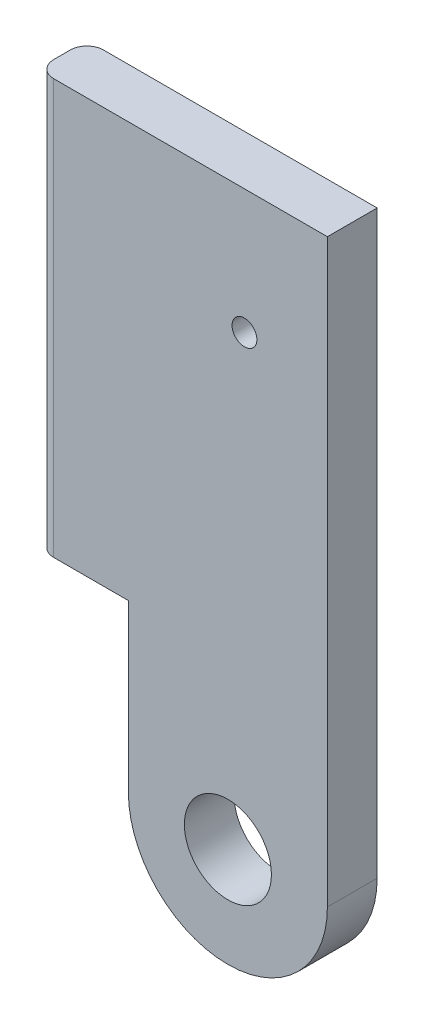
ISO-10303-21;
HEADER;
FILE_DESCRIPTION(('STEP AP214'),'2;1');
FILE_NAME('part.step','',(''),(''),'','','');
FILE_SCHEMA(('AUTOMOTIVE_DESIGN { 1 0 10303 214 1 1 1 1 }'));
ENDSEC;
DATA;
#1=APPLICATION_CONTEXT('core data for automotive mechanical design processes');
#2=APPLICATION_PROTOCOL_DEFINITION('international standard','automotive_design',2000,#1);
#3=PRODUCT_CONTEXT('',#1,'mechanical');
#4=PRODUCT('Part','Part','',(#3));
#5=PRODUCT_RELATED_PRODUCT_CATEGORY('part','',(#4));
#6=PRODUCT_DEFINITION_FORMATION('','',#4);
#7=PRODUCT_DEFINITION_CONTEXT('part definition',#1,'design');
#8=PRODUCT_DEFINITION('design','',#6,#7);
#9=PRODUCT_DEFINITION_SHAPE('','',#8);
#10=(LENGTH_UNIT() NAMED_UNIT(*) SI_UNIT(.MILLI.,.METRE.));
#11=(NAMED_UNIT(*) PLANE_ANGLE_UNIT() SI_UNIT($,.RADIAN.));
#12=(NAMED_UNIT(*) SI_UNIT($,.STERADIAN.) SOLID_ANGLE_UNIT());
#13=UNCERTAINTY_MEASURE_WITH_UNIT(LENGTH_MEASURE(1.E-05),#10,'distance_accuracy_value','');
#14=(GEOMETRIC_REPRESENTATION_CONTEXT(3) GLOBAL_UNCERTAINTY_ASSIGNED_CONTEXT((#13)) GLOBAL_UNIT_ASSIGNED_CONTEXT((#10,
#11,#12)) REPRESENTATION_CONTEXT('',''));
#15=CARTESIAN_POINT('',(0.,0.,0.));
#16=DIRECTION('',(0.,0.,1.));
#17=DIRECTION('',(1.,0.,0.));
#18=AXIS2_PLACEMENT_3D('',#15,#16,#17);
#19=CARTESIAN_POINT('',(0.,0.,3.));
#20=DIRECTION('',(0.,0.,-1.));
#21=DIRECTION('',(-1.,0.,0.));
#22=AXIS2_PLACEMENT_3D('',#19,#20,#21);
#23=CYLINDRICAL_SURFACE('',#22,6.);
#24=CARTESIAN_POINT('',(0.,0.,0.));
#25=DIRECTION('',(0.,0.,1.));
#26=DIRECTION('',(1.,0.,0.));
#27=AXIS2_PLACEMENT_3D('',#24,#25,#26);
#28=CIRCLE('',#27,6.);
#29=CARTESIAN_POINT('',(-6.,0.,0.));
#30=VERTEX_POINT('',#29);
#31=CARTESIAN_POINT('',(6.,0.,0.));
#32=VERTEX_POINT('',#31);
#33=EDGE_CURVE('E148',#30,#32,#28,.T.);
#34=ORIENTED_EDGE('',*,*,#33,.T.);
#35=DIRECTION('',(0.,0.,-1.));
#36=VECTOR('',#35,1.);
#37=CARTESIAN_POINT('',(6.,0.,3.));
#38=LINE('',#37,#36);
#39=CARTESIAN_POINT('',(6.,0.,3.));
#40=VERTEX_POINT('',#39);
#41=EDGE_CURVE('E131',#40,#32,#38,.T.);
#42=ORIENTED_EDGE('',*,*,#41,.F.);
#43=CARTESIAN_POINT('',(0.,0.,3.));
#44=DIRECTION('',(0.,0.,1.));
#45=DIRECTION('',(1.,0.,0.));
#46=AXIS2_PLACEMENT_3D('',#43,#44,#45);
#47=CIRCLE('',#46,6.);
#48=CARTESIAN_POINT('',(-6.,0.,3.));
#49=VERTEX_POINT('',#48);
#50=EDGE_CURVE('E137',#49,#40,#47,.T.);
#51=ORIENTED_EDGE('',*,*,#50,.F.);
#52=DIRECTION('',(0.,0.,-1.));
#53=VECTOR('',#52,1.);
#54=CARTESIAN_POINT('',(-6.,0.,3.));
#55=LINE('',#54,#53);
#56=EDGE_CURVE('E324',#49,#30,#55,.T.);
#57=ORIENTED_EDGE('',*,*,#56,.T.);
#58=EDGE_LOOP('',(#34,#42,#51,#57));
#59=FACE_BOUND('',#58,.T.);
#60=ADVANCED_FACE('F52',(#59),#23,.T.);
#61=CARTESIAN_POINT('',(6.,0.,3.));
#62=DIRECTION('',(-1.,0.,0.));
#63=DIRECTION('',(0.,0.,1.));
#64=AXIS2_PLACEMENT_3D('',#61,#62,#63);
#65=PLANE('',#64);
#66=DIRECTION('',(0.,1.,0.));
#67=VECTOR('',#66,1.);
#68=CARTESIAN_POINT('',(6.,0.,0.));
#69=LINE('',#68,#67);
#70=CARTESIAN_POINT('',(6.,35.,0.));
#71=VERTEX_POINT('',#70);
#72=EDGE_CURVE('E328',#32,#71,#69,.T.);
#73=ORIENTED_EDGE('',*,*,#72,.T.);
#74=DIRECTION('',(0.,0.,-1.));
#75=VECTOR('',#74,1.);
#76=CARTESIAN_POINT('',(6.,35.,3.));
#77=LINE('',#76,#75);
#78=CARTESIAN_POINT('',(6.,35.,3.));
#79=VERTEX_POINT('',#78);
#80=EDGE_CURVE('E134',#79,#71,#77,.T.);
#81=ORIENTED_EDGE('',*,*,#80,.F.);
#82=DIRECTION('',(0.,1.,0.));
#83=VECTOR('',#82,1.);
#84=CARTESIAN_POINT('',(6.,0.,3.));
#85=LINE('',#84,#83);
#86=EDGE_CURVE('E127',#40,#79,#85,.T.);
#87=ORIENTED_EDGE('',*,*,#86,.F.);
#88=ORIENTED_EDGE('',*,*,#41,.T.);
#89=EDGE_LOOP('',(#73,#81,#87,#88));
#90=FACE_BOUND('',#89,.T.);
#91=ADVANCED_FACE('F129',(#90),#65,.F.);
#92=CARTESIAN_POINT('',(0.,35.,3.));
#93=DIRECTION('',(0.,-1.,0.));
#94=DIRECTION('',(0.,0.,-1.));
#95=AXIS2_PLACEMENT_3D('',#92,#93,#94);
#96=PLANE('',#95);
#97=DIRECTION('',(-1.,0.,0.));
#98=VECTOR('',#97,1.);
#99=CARTESIAN_POINT('',(0.,35.,0.));
#100=LINE('',#99,#98);
#101=CARTESIAN_POINT('',(-10.5,35.,0.));
#102=VERTEX_POINT('',#101);
#103=EDGE_CURVE('E330',#71,#102,#100,.T.);
#104=ORIENTED_EDGE('',*,*,#103,.T.);
#105=CARTESIAN_POINT('',(-10.5,35.,0.));
#106=CARTESIAN_POINT('',(-10.528134745567,35.,2.0038154817115E-07));
#107=CARTESIAN_POINT('',(-10.5562560017052,35.,0.00118809679022485));
#108=CARTESIAN_POINT('',(-10.6122973163283,35.,0.00592711504418035));
#109=CARTESIAN_POINT('',(-10.6402173841614,35.,0.00947812636110437));
#110=CARTESIAN_POINT('',(-10.7233269372849,35.,0.0236421542785591));
#111=CARTESIAN_POINT('',(-10.7779597520746,35.,0.0377662582328391));
#112=CARTESIAN_POINT('',(-10.8840769200263,35.,0.0749850962645601));
#113=CARTESIAN_POINT('',(-10.9355597476392,35.,0.0980841377475002));
#114=CARTESIAN_POINT('',(-11.0339160760032,35.,0.152596958115516));
#115=CARTESIAN_POINT('',(-11.0807903867524,35.,0.184009272254657));
#116=CARTESIAN_POINT('',(-11.1685994578614,35.,0.254252908299715));
#117=CARTESIAN_POINT('',(-11.2095336469101,35.,0.29308494299118));
#118=CARTESIAN_POINT('',(-11.2843139872613,35.,0.377095803868768));
#119=CARTESIAN_POINT('',(-11.3181602528144,35.,0.422274527732598));
#120=CARTESIAN_POINT('',(-11.3628702542627,35.,0.493789005279562));
#121=CARTESIAN_POINT('',(-11.3767725615212,35.,0.518273097453774));
#122=CARTESIAN_POINT('',(-11.4024553813564,35.,0.568300426426298));
#123=CARTESIAN_POINT('',(-11.4142377704311,35.,0.593842701658703));
#124=CARTESIAN_POINT('',(-11.4462808360317,35.,0.671820372697225));
#125=CARTESIAN_POINT('',(-11.4632684766767,35.,0.725656399976932));
#126=CARTESIAN_POINT('',(-11.4837173856166,35.,0.816509408823386));
#127=CARTESIAN_POINT('',(-11.4898193941278,35.,0.852963997925001));
#128=CARTESIAN_POINT('',(-11.4979590428387,35.,0.92627167450077));
#129=CARTESIAN_POINT('',(-11.5000024450033,35.,0.963124122244663));
#130=CARTESIAN_POINT('',(-11.5,35.,1.));
#131=B_SPLINE_CURVE_WITH_KNOTS('',3,(#105,#106,#107,#108,#109,#110,#111,#112,#113,#114,#115,
#116,#117,#118,#119,#120,#121,#122,#123,#124,#125,#126,#127,#128,#129,#130),.UNSPECIFIED.,.F.,
.F.,(4,2,2,2,2,2,2,2,2,2,2,2,4),(0.,0.084352371968045,0.168700798857648,0.337119301179928,
0.505618733832967,0.674088497696919,0.842574453982341,1.01105769422312,1.09543727445699,
1.17974179257301,1.34817695086742,1.45885920377358,1.56938420949917),.UNSPECIFIED.);
#132=CARTESIAN_POINT('',(-11.5,35.,1.));
#133=VERTEX_POINT('',#132);
#134=EDGE_CURVE('E66',#102,#133,#131,.T.);
#135=ORIENTED_EDGE('',*,*,#134,.T.);
#136=DIRECTION('',(0.,0.,-1.));
#137=VECTOR('',#136,1.);
#138=CARTESIAN_POINT('',(-11.5,35.,3.));
#139=LINE('',#138,#137);
#140=CARTESIAN_POINT('',(-11.5,35.,2.));
#141=VERTEX_POINT('',#140);
#142=EDGE_CURVE('E153',#141,#133,#139,.T.);
#143=ORIENTED_EDGE('',*,*,#142,.F.);
#144=CARTESIAN_POINT('',(-11.5,35.,2.));
#145=CARTESIAN_POINT('',(-11.4999997996185,35.,2.02813474556703));
#146=CARTESIAN_POINT('',(-11.4988119032098,35.,2.05625600170525));
#147=CARTESIAN_POINT('',(-11.4940728849558,35.,2.11229731632827));
#148=CARTESIAN_POINT('',(-11.4905218736389,35.,2.14021738416138));
#149=CARTESIAN_POINT('',(-11.4763578457214,35.,2.22332693728486));
#150=CARTESIAN_POINT('',(-11.4622337417672,35.,2.27795975207461));
#151=CARTESIAN_POINT('',(-11.4250149037354,35.,2.3840769200263));
#152=CARTESIAN_POINT('',(-11.4019158622525,35.,2.43555974763917));
#153=CARTESIAN_POINT('',(-11.3474030418845,35.,2.53391607600322));
#154=CARTESIAN_POINT('',(-11.3159907277453,35.,2.58079038675238));
#155=CARTESIAN_POINT('',(-11.2457470917003,35.,2.66859945786141));
#156=CARTESIAN_POINT('',(-11.2069150570088,35.,2.70953364691012));
#157=CARTESIAN_POINT('',(-11.1229041961312,35.,2.78431398726128));
#158=CARTESIAN_POINT('',(-11.0777254722674,35.,2.81816025281441));
#159=CARTESIAN_POINT('',(-11.0062109947204,35.,2.86287025426275));
#160=CARTESIAN_POINT('',(-10.9817269025462,35.,2.87677256152116));
#161=CARTESIAN_POINT('',(-10.9316995735737,35.,2.90245538135645));
#162=CARTESIAN_POINT('',(-10.9061572983413,35.,2.91423777043113));
#163=CARTESIAN_POINT('',(-10.8281796273028,35.,2.9462808360317));
#164=CARTESIAN_POINT('',(-10.7743436000231,35.,2.96326847667666));
#165=CARTESIAN_POINT('',(-10.6834905911766,35.,2.9837173856166));
#166=CARTESIAN_POINT('',(-10.647036002075,35.,2.98981939412778));
#167=CARTESIAN_POINT('',(-10.5737283254992,35.,2.99795904283868));
#168=CARTESIAN_POINT('',(-10.5368758777553,35.,3.00000244500329));
#169=CARTESIAN_POINT('',(-10.5,35.,3.));
#170=B_SPLINE_CURVE_WITH_KNOTS('',3,(#144,#145,#146,#147,#148,#149,#150,#151,#152,#153,#154,
#155,#156,#157,#158,#159,#160,#161,#162,#163,#164,#165,#166,#167,#168,#169),.UNSPECIFIED.,.F.,
.F.,(4,2,2,2,2,2,2,2,2,2,2,2,4),(0.,0.0843523719680468,0.16870079885765,0.337119301179931,
0.505618733832972,0.674088497696924,0.842574453982346,1.01105769422312,1.09543727445699,
1.17974179257301,1.34817695086743,1.45885920377358,1.56938420949917),.UNSPECIFIED.);
#171=CARTESIAN_POINT('',(-10.5,35.,3.));
#172=VERTEX_POINT('',#171);
#173=EDGE_CURVE('E73',#141,#172,#170,.T.);
#174=ORIENTED_EDGE('',*,*,#173,.T.);
#175=DIRECTION('',(-1.,0.,0.));
#176=VECTOR('',#175,1.);
#177=CARTESIAN_POINT('',(0.,35.,3.));
#178=LINE('',#177,#176);
#179=EDGE_CURVE('E136',#79,#172,#178,.T.);
#180=ORIENTED_EDGE('',*,*,#179,.F.);
#181=ORIENTED_EDGE('',*,*,#80,.T.);
#182=EDGE_LOOP('',(#104,#135,#143,#174,#180,#181));
#183=FACE_BOUND('',#182,.T.);
#184=ADVANCED_FACE('F195',(#183),#96,.F.);
#185=CARTESIAN_POINT('',(-11.5,0.,3.));
#186=DIRECTION('',(1.,0.,0.));
#187=DIRECTION('',(0.,1.,0.));
#188=AXIS2_PLACEMENT_3D('',#185,#186,#187);
#189=PLANE('',#188);
#190=ORIENTED_EDGE('',*,*,#142,.T.);
#191=CARTESIAN_POINT('',(-11.5,85.,1.));
#192=CARTESIAN_POINT('',(-11.5,68.3333333333333,1.));
#193=CARTESIAN_POINT('',(-11.5,51.6666666666667,1.));
#194=CARTESIAN_POINT('',(-11.5,35.,1.));
#195=CARTESIAN_POINT('',(-11.5,26.6666666666667,1.));
#196=CARTESIAN_POINT('',(-11.5,18.3333333333333,1.));
#197=CARTESIAN_POINT('',(-11.5,10.,1.));
#198=CARTESIAN_POINT('',(-11.5,-6.66666666666667,1.));
#199=CARTESIAN_POINT('',(-11.5,-23.3333333333333,1.));
#200=CARTESIAN_POINT('',(-11.5,-40.,1.));
#201=(BOUNDED_CURVE() B_SPLINE_CURVE(3,(#191,#192,#193,#194,#195,#196,#197,#198,#199,#200),
.UNSPECIFIED.,.F.,.F.) B_SPLINE_CURVE_WITH_KNOTS((4,3,3,4),(-0.085,-0.035,-0.01,0.04),
.UNSPECIFIED.) CURVE() GEOMETRIC_REPRESENTATION_ITEM() RATIONAL_B_SPLINE_CURVE((1.,1.,1.,1.,1.,
1.,1.,1.,1.,1.)) REPRESENTATION_ITEM(''));
#202=CARTESIAN_POINT('',(-11.5,10.,1.));
#203=VERTEX_POINT('',#202);
#204=EDGE_CURVE('E151',#133,#203,#201,.T.);
#205=ORIENTED_EDGE('',*,*,#204,.T.);
#206=DIRECTION('',(0.,0.,-1.));
#207=VECTOR('',#206,1.);
#208=CARTESIAN_POINT('',(-11.5,10.,3.));
#209=LINE('',#208,#207);
#210=CARTESIAN_POINT('',(-11.5,10.,2.));
#211=VERTEX_POINT('',#210);
#212=EDGE_CURVE('E340',#211,#203,#209,.T.);
#213=ORIENTED_EDGE('',*,*,#212,.F.);
#214=CARTESIAN_POINT('',(-11.5,85.,2.));
#215=CARTESIAN_POINT('',(-11.5,68.3333333333333,2.));
#216=CARTESIAN_POINT('',(-11.5,51.6666666666667,2.));
#217=CARTESIAN_POINT('',(-11.5,35.,2.));
#218=CARTESIAN_POINT('',(-11.5,26.6666666666667,2.));
#219=CARTESIAN_POINT('',(-11.5,18.3333333333333,2.));
#220=CARTESIAN_POINT('',(-11.5,10.,2.));
#221=CARTESIAN_POINT('',(-11.5,-6.66666666666667,2.));
#222=CARTESIAN_POINT('',(-11.5,-23.3333333333333,2.));
#223=CARTESIAN_POINT('',(-11.5,-40.,2.));
#224=(BOUNDED_CURVE() B_SPLINE_CURVE(3,(#214,#215,#216,#217,#218,#219,#220,#221,#222,#223),
.UNSPECIFIED.,.F.,.F.) B_SPLINE_CURVE_WITH_KNOTS((4,3,3,4),(-0.085,-0.035,-0.01,0.04),
.UNSPECIFIED.) CURVE() GEOMETRIC_REPRESENTATION_ITEM() RATIONAL_B_SPLINE_CURVE((1.,1.,1.,1.,1.,
1.,1.,1.,1.,1.)) REPRESENTATION_ITEM(''));
#225=EDGE_CURVE('E149',#211,#141,#224,.F.);
#226=ORIENTED_EDGE('',*,*,#225,.T.);
#227=EDGE_LOOP('',(#190,#205,#213,#226));
#228=FACE_BOUND('',#227,.T.);
#229=ADVANCED_FACE('F188',(#228),#189,.F.);
#230=CARTESIAN_POINT('',(0.,10.,3.));
#231=DIRECTION('',(0.,1.,0.));
#232=DIRECTION('',(0.,0.,1.));
#233=AXIS2_PLACEMENT_3D('',#230,#231,#232);
#234=PLANE('',#233);
#235=ORIENTED_EDGE('',*,*,#212,.T.);
#236=CARTESIAN_POINT('',(-11.5,10.,1.));
#237=CARTESIAN_POINT('',(-11.4999997996185,10.,0.971865254432972));
#238=CARTESIAN_POINT('',(-11.4988119032098,10.,0.943743998294751));
#239=CARTESIAN_POINT('',(-11.4940728849558,10.,0.88770268367173));
#240=CARTESIAN_POINT('',(-11.4905218736389,10.,0.859782615838623));
#241=CARTESIAN_POINT('',(-11.4763578457214,10.,0.776673062715144));
#242=CARTESIAN_POINT('',(-11.4622337417672,10.,0.722040247925385));
#243=CARTESIAN_POINT('',(-11.4250149037354,10.,0.615923079973702));
#244=CARTESIAN_POINT('',(-11.4019158622525,10.,0.564440252360828));
#245=CARTESIAN_POINT('',(-11.3474030418845,10.,0.466083923996782));
#246=CARTESIAN_POINT('',(-11.3159907277453,10.,0.419209613247622));
#247=CARTESIAN_POINT('',(-11.2457470917003,10.,0.331400542138593));
#248=CARTESIAN_POINT('',(-11.2069150570088,10.,0.290466353089878));
#249=CARTESIAN_POINT('',(-11.1229041961312,10.,0.215686012738716));
#250=CARTESIAN_POINT('',(-11.0777254722674,10.,0.181839747185592));
#251=CARTESIAN_POINT('',(-11.0062109947204,10.,0.137129745737251));
#252=CARTESIAN_POINT('',(-10.9817269025462,10.,0.123227438478842));
#253=CARTESIAN_POINT('',(-10.9316995735737,10.,0.097544618643551));
#254=CARTESIAN_POINT('',(-10.9061572983413,10.,0.0857622295688718));
#255=CARTESIAN_POINT('',(-10.8281796273028,10.,0.0537191639682964));
#256=CARTESIAN_POINT('',(-10.7743436000231,10.,0.0367315233233404));
#257=CARTESIAN_POINT('',(-10.6834905911766,10.,0.0162826143833998));
#258=CARTESIAN_POINT('',(-10.647036002075,10.,0.0101806058722241));
#259=CARTESIAN_POINT('',(-10.5737283254992,10.,0.00204095716132475));
#260=CARTESIAN_POINT('',(-10.5368758777553,10.,-2.44500328447076E-06));
#261=CARTESIAN_POINT('',(-10.5,10.,0.));
#262=B_SPLINE_CURVE_WITH_KNOTS('',3,(#236,#237,#238,#239,#240,#241,#242,#243,#244,#245,#246,
#247,#248,#249,#250,#251,#252,#253,#254,#255,#256,#257,#258,#259,#260,#261),.UNSPECIFIED.,.F.,
.F.,(4,2,2,2,2,2,2,2,2,2,2,2,4),(0.,0.0843523719680465,0.16870079885765,0.337119301179932,
0.505618733832972,0.674088497696926,0.842574453982349,1.01105769422313,1.09543727445699,
1.17974179257302,1.34817695086743,1.45885920377359,1.56938420949917),.UNSPECIFIED.);
#263=CARTESIAN_POINT('',(-10.5,10.,0.));
#264=VERTEX_POINT('',#263);
#265=EDGE_CURVE('E176',#203,#264,#262,.T.);
#266=ORIENTED_EDGE('',*,*,#265,.T.);
#267=DIRECTION('',(1.,0.,0.));
#268=VECTOR('',#267,1.);
#269=CARTESIAN_POINT('',(0.,10.,0.));
#270=LINE('',#269,#268);
#271=CARTESIAN_POINT('',(-6.,10.,0.));
#272=VERTEX_POINT('',#271);
#273=EDGE_CURVE('E332',#264,#272,#270,.T.);
#274=ORIENTED_EDGE('',*,*,#273,.T.);
#275=DIRECTION('',(0.,0.,-1.));
#276=VECTOR('',#275,1.);
#277=CARTESIAN_POINT('',(-6.,10.,3.));
#278=LINE('',#277,#276);
#279=CARTESIAN_POINT('',(-6.,10.,3.));
#280=VERTEX_POINT('',#279);
#281=EDGE_CURVE('E337',#280,#272,#278,.T.);
#282=ORIENTED_EDGE('',*,*,#281,.F.);
#283=DIRECTION('',(1.,0.,0.));
#284=VECTOR('',#283,1.);
#285=CARTESIAN_POINT('',(0.,10.,3.));
#286=LINE('',#285,#284);
#287=CARTESIAN_POINT('',(-10.5,10.,3.));
#288=VERTEX_POINT('',#287);
#289=EDGE_CURVE('E321',#288,#280,#286,.T.);
#290=ORIENTED_EDGE('',*,*,#289,.F.);
#291=CARTESIAN_POINT('',(-10.5,10.,3.));
#292=CARTESIAN_POINT('',(-10.528134745567,10.,2.99999979961845));
#293=CARTESIAN_POINT('',(-10.5562560017052,10.,2.99881190320978));
#294=CARTESIAN_POINT('',(-10.6122973163283,10.,2.99407288495582));
#295=CARTESIAN_POINT('',(-10.6402173841614,10.,2.9905218736389));
#296=CARTESIAN_POINT('',(-10.7233269372849,10.,2.97635784572144));
#297=CARTESIAN_POINT('',(-10.7779597520746,10.,2.96223374176716));
#298=CARTESIAN_POINT('',(-10.8840769200263,10.,2.92501490373544));
#299=CARTESIAN_POINT('',(-10.9355597476392,10.,2.9019158622525));
#300=CARTESIAN_POINT('',(-11.0339160760032,10.,2.84740304188448));
#301=CARTESIAN_POINT('',(-11.0807903867524,10.,2.81599072774534));
#302=CARTESIAN_POINT('',(-11.1685994578614,10.,2.74574709170028));
#303=CARTESIAN_POINT('',(-11.2095336469101,10.,2.70691505700882));
#304=CARTESIAN_POINT('',(-11.2843139872613,10.,2.62290419613123));
#305=CARTESIAN_POINT('',(-11.3181602528144,10.,2.5777254722674));
#306=CARTESIAN_POINT('',(-11.3628702542627,10.,2.50621099472043));
#307=CARTESIAN_POINT('',(-11.3767725615212,10.,2.48172690254622));
#308=CARTESIAN_POINT('',(-11.4024553813564,10.,2.4316995735737));
#309=CARTESIAN_POINT('',(-11.4142377704311,10.,2.40615729834129));
#310=CARTESIAN_POINT('',(-11.4462808360317,10.,2.32817962730277));
#311=CARTESIAN_POINT('',(-11.4632684766767,10.,2.27434360002306));
#312=CARTESIAN_POINT('',(-11.4837173856166,10.,2.18349059117661));
#313=CARTESIAN_POINT('',(-11.4898193941278,10.,2.14703600207499));
#314=CARTESIAN_POINT('',(-11.4979590428387,10.,2.07372832549923));
#315=CARTESIAN_POINT('',(-11.5000024450033,10.,2.03687587775534));
#316=CARTESIAN_POINT('',(-11.5,10.,2.));
#317=B_SPLINE_CURVE_WITH_KNOTS('',3,(#291,#292,#293,#294,#295,#296,#297,#298,#299,#300,#301,
#302,#303,#304,#305,#306,#307,#308,#309,#310,#311,#312,#313,#314,#315,#316),.UNSPECIFIED.,.F.,
.F.,(4,2,2,2,2,2,2,2,2,2,2,2,4),(0.,0.084352371968045,0.168700798857648,0.337119301179932,
0.505618733832973,0.674088497696926,0.84257445398235,1.01105769422313,1.095437274457,
1.17974179257302,1.34817695086743,1.45885920377359,1.56938420949918),.UNSPECIFIED.);
#318=EDGE_CURVE('E166',#288,#211,#317,.T.);
#319=ORIENTED_EDGE('',*,*,#318,.T.);
#320=EDGE_LOOP('',(#235,#266,#274,#282,#290,#319));
#321=FACE_BOUND('',#320,.T.);
#322=ADVANCED_FACE('F182',(#321),#234,.F.);
#323=CARTESIAN_POINT('',(0.,0.,3.));
#324=DIRECTION('',(0.,0.,-1.));
#325=DIRECTION('',(-1.,0.,0.));
#326=AXIS2_PLACEMENT_3D('',#323,#324,#325);
#327=CYLINDRICAL_SURFACE('',#326,2.625);
#328=CARTESIAN_POINT('',(0.,0.,3.));
#329=DIRECTION('',(0.,0.,1.));
#330=DIRECTION('',(1.,0.,0.));
#331=AXIS2_PLACEMENT_3D('',#328,#329,#330);
#332=CIRCLE('',#331,2.625);
#333=CARTESIAN_POINT('',(2.625,0.,3.));
#334=VERTEX_POINT('',#333);
#335=EDGE_CURVE('E145',#334,#334,#332,.T.);
#336=ORIENTED_EDGE('',*,*,#335,.T.);
#337=EDGE_LOOP('',(#336));
#338=FACE_BOUND('',#337,.T.);
#339=CARTESIAN_POINT('',(0.,0.,0.));
#340=DIRECTION('',(0.,0.,1.));
#341=DIRECTION('',(1.,0.,0.));
#342=AXIS2_PLACEMENT_3D('',#339,#340,#341);
#343=CIRCLE('',#342,2.625);
#344=CARTESIAN_POINT('',(2.625,0.,0.));
#345=VERTEX_POINT('',#344);
#346=EDGE_CURVE('E314',#345,#345,#343,.T.);
#347=ORIENTED_EDGE('',*,*,#346,.F.);
#348=EDGE_LOOP('',(#347));
#349=FACE_BOUND('',#348,.T.);
#350=ADVANCED_FACE('F187',(#338,#349),#327,.F.);
#351=CARTESIAN_POINT('',(-6.,0.,3.));
#352=DIRECTION('',(-1.,0.,0.));
#353=DIRECTION('',(0.,0.,1.));
#354=AXIS2_PLACEMENT_3D('',#351,#352,#353);
#355=PLANE('',#354);
#356=DIRECTION('',(0.,1.,0.));
#357=VECTOR('',#356,1.);
#358=CARTESIAN_POINT('',(-6.,0.,0.));
#359=LINE('',#358,#357);
#360=EDGE_CURVE('E318',#30,#272,#359,.T.);
#361=ORIENTED_EDGE('',*,*,#360,.F.);
#362=ORIENTED_EDGE('',*,*,#56,.F.);
#363=DIRECTION('',(0.,1.,0.));
#364=VECTOR('',#363,1.);
#365=CARTESIAN_POINT('',(-6.,0.,3.));
#366=LINE('',#365,#364);
#367=EDGE_CURVE('E143',#49,#280,#366,.T.);
#368=ORIENTED_EDGE('',*,*,#367,.T.);
#369=ORIENTED_EDGE('',*,*,#281,.T.);
#370=EDGE_LOOP('',(#361,#362,#368,#369));
#371=FACE_BOUND('',#370,.T.);
#372=ADVANCED_FACE('F190',(#371),#355,.T.);
#373=CARTESIAN_POINT('',(0.,0.,3.));
#374=DIRECTION('',(0.,0.,1.));
#375=DIRECTION('',(1.,0.,0.));
#376=AXIS2_PLACEMENT_3D('',#373,#374,#375);
#377=PLANE('',#376);
#378=CARTESIAN_POINT('',(1.,27.5,3.));
#379=DIRECTION('',(0.,0.,1.));
#380=DIRECTION('',(1.,0.,0.));
#381=AXIS2_PLACEMENT_3D('',#378,#379,#380);
#382=CIRCLE('',#381,0.750000000000001);
#383=CARTESIAN_POINT('',(1.75,27.5,3.));
#384=VERTEX_POINT('',#383);
#385=EDGE_CURVE('E309',#384,#384,#382,.T.);
#386=ORIENTED_EDGE('',*,*,#385,.F.);
#387=EDGE_LOOP('',(#386));
#388=FACE_BOUND('',#387,.T.);
#389=ORIENTED_EDGE('',*,*,#335,.F.);
#390=EDGE_LOOP('',(#389));
#391=FACE_BOUND('',#390,.T.);
#392=ORIENTED_EDGE('',*,*,#179,.T.);
#393=CARTESIAN_POINT('',(-10.5,85.,3.));
#394=CARTESIAN_POINT('',(-10.5,68.3333333333333,3.));
#395=CARTESIAN_POINT('',(-10.5,51.6666666666667,3.));
#396=CARTESIAN_POINT('',(-10.5,35.,3.));
#397=CARTESIAN_POINT('',(-10.5,26.6666666666667,3.));
#398=CARTESIAN_POINT('',(-10.5,18.3333333333333,3.));
#399=CARTESIAN_POINT('',(-10.5,10.,3.));
#400=CARTESIAN_POINT('',(-10.5,-6.66666666666667,3.));
#401=CARTESIAN_POINT('',(-10.5,-23.3333333333333,3.));
#402=CARTESIAN_POINT('',(-10.5,-40.,3.));
#403=(BOUNDED_CURVE() B_SPLINE_CURVE(3,(#393,#394,#395,#396,#397,#398,#399,#400,#401,#402),
.UNSPECIFIED.,.F.,.F.) B_SPLINE_CURVE_WITH_KNOTS((4,3,3,4),(-0.085,-0.035,-0.01,0.04),
.UNSPECIFIED.) CURVE() GEOMETRIC_REPRESENTATION_ITEM() RATIONAL_B_SPLINE_CURVE((1.,1.,1.,1.,1.,
1.,1.,1.,1.,1.)) REPRESENTATION_ITEM(''));
#404=EDGE_CURVE('E13',#172,#288,#403,.T.);
#405=ORIENTED_EDGE('',*,*,#404,.T.);
#406=ORIENTED_EDGE('',*,*,#289,.T.);
#407=ORIENTED_EDGE('',*,*,#367,.F.);
#408=ORIENTED_EDGE('',*,*,#50,.T.);
#409=ORIENTED_EDGE('',*,*,#86,.T.);
#410=EDGE_LOOP('',(#392,#405,#406,#407,#408,#409));
#411=FACE_BOUND('',#410,.T.);
#412=ADVANCED_FACE('F141',(#388,#391,#411),#377,.T.);
#413=CARTESIAN_POINT('',(0.,0.,0.));
#414=DIRECTION('',(0.,0.,1.));
#415=DIRECTION('',(1.,0.,0.));
#416=AXIS2_PLACEMENT_3D('',#413,#414,#415);
#417=PLANE('',#416);
#418=CARTESIAN_POINT('',(1.,27.5,0.));
#419=DIRECTION('',(0.,0.,-1.));
#420=DIRECTION('',(-1.,0.,0.));
#421=AXIS2_PLACEMENT_3D('',#418,#419,#420);
#422=CIRCLE('',#421,0.750000000000001);
#423=CARTESIAN_POINT('',(0.249999999999999,27.5,0.));
#424=VERTEX_POINT('',#423);
#425=EDGE_CURVE('E312',#424,#424,#422,.T.);
#426=ORIENTED_EDGE('',*,*,#425,.F.);
#427=EDGE_LOOP('',(#426));
#428=FACE_BOUND('',#427,.T.);
#429=ORIENTED_EDGE('',*,*,#346,.T.);
#430=EDGE_LOOP('',(#429));
#431=FACE_BOUND('',#430,.T.);
#432=ORIENTED_EDGE('',*,*,#273,.F.);
#433=CARTESIAN_POINT('',(-10.5,85.,0.));
#434=CARTESIAN_POINT('',(-10.5,68.3333333333333,0.));
#435=CARTESIAN_POINT('',(-10.5,51.6666666666667,0.));
#436=CARTESIAN_POINT('',(-10.5,35.,0.));
#437=CARTESIAN_POINT('',(-10.5,26.6666666666667,0.));
#438=CARTESIAN_POINT('',(-10.5,18.3333333333333,0.));
#439=CARTESIAN_POINT('',(-10.5,10.,0.));
#440=CARTESIAN_POINT('',(-10.5,-6.66666666666667,0.));
#441=CARTESIAN_POINT('',(-10.5,-23.3333333333333,0.));
#442=CARTESIAN_POINT('',(-10.5,-40.,0.));
#443=(BOUNDED_CURVE() B_SPLINE_CURVE(3,(#433,#434,#435,#436,#437,#438,#439,#440,#441,#442),
.UNSPECIFIED.,.F.,.F.) B_SPLINE_CURVE_WITH_KNOTS((4,3,3,4),(-0.085,-0.035,-0.01,0.04),
.UNSPECIFIED.) CURVE() GEOMETRIC_REPRESENTATION_ITEM() RATIONAL_B_SPLINE_CURVE((1.,1.,1.,1.,1.,
1.,1.,1.,1.,1.)) REPRESENTATION_ITEM(''));
#444=EDGE_CURVE('E81',#264,#102,#443,.F.);
#445=ORIENTED_EDGE('',*,*,#444,.T.);
#446=ORIENTED_EDGE('',*,*,#103,.F.);
#447=ORIENTED_EDGE('',*,*,#72,.F.);
#448=ORIENTED_EDGE('',*,*,#33,.F.);
#449=ORIENTED_EDGE('',*,*,#360,.T.);
#450=EDGE_LOOP('',(#432,#445,#446,#447,#448,#449));
#451=FACE_BOUND('',#450,.T.);
#452=ADVANCED_FACE('F220',(#428,#431,#451),#417,.F.);
#453=CARTESIAN_POINT('',(-11.5,40.,1.));
#454=CARTESIAN_POINT('',(-11.5,38.3333333333333,1.));
#455=CARTESIAN_POINT('',(-11.5,36.6666666666667,1.));
#456=CARTESIAN_POINT('',(-11.5,35.,1.));
#457=CARTESIAN_POINT('',(-11.5,26.6666666666667,1.));
#458=CARTESIAN_POINT('',(-11.5,18.3333333333333,1.));
#459=CARTESIAN_POINT('',(-11.5,10.,1.));
#460=CARTESIAN_POINT('',(-11.5,8.33333333333333,1.));
#461=CARTESIAN_POINT('',(-11.5,6.66666666666666,1.));
#462=CARTESIAN_POINT('',(-11.5,5.,1.));
#463=CARTESIAN_POINT('',(-11.5,40.,0.));
#464=CARTESIAN_POINT('',(-11.5,38.3333333333333,0.));
#465=CARTESIAN_POINT('',(-11.5,36.6666666666667,0.));
#466=CARTESIAN_POINT('',(-11.5,35.,0.));
#467=CARTESIAN_POINT('',(-11.5,26.6666666666667,0.));
#468=CARTESIAN_POINT('',(-11.5,18.3333333333333,0.));
#469=CARTESIAN_POINT('',(-11.5,10.,0.));
#470=CARTESIAN_POINT('',(-11.5,8.33333333333333,0.));
#471=CARTESIAN_POINT('',(-11.5,6.66666666666666,0.));
#472=CARTESIAN_POINT('',(-11.5,5.,0.));
#473=CARTESIAN_POINT('',(-10.5,40.,0.));
#474=CARTESIAN_POINT('',(-10.5,38.3333333333333,0.));
#475=CARTESIAN_POINT('',(-10.5,36.6666666666667,0.));
#476=CARTESIAN_POINT('',(-10.5,35.,0.));
#477=CARTESIAN_POINT('',(-10.5,26.6666666666667,0.));
#478=CARTESIAN_POINT('',(-10.5,18.3333333333333,0.));
#479=CARTESIAN_POINT('',(-10.5,10.,0.));
#480=CARTESIAN_POINT('',(-10.5,8.33333333333333,0.));
#481=CARTESIAN_POINT('',(-10.5,6.66666666666666,0.));
#482=CARTESIAN_POINT('',(-10.5,5.,0.));
#483=(BOUNDED_SURFACE() B_SPLINE_SURFACE(2,3,((#453,#454,#455,#456,#457,#458,#459,#460,#461,
#462),(#463,#464,#465,#466,#467,#468,#469,#470,#471,#472),(#473,#474,#475,#476,#477,#478,#479,
#480,#481,#482)),.UNSPECIFIED.,.F.,.F.,.F.) B_SPLINE_SURFACE_WITH_KNOTS((3,3),(4,3,3,4),(0.,1.),
(-0.04,-0.035,-0.01,-0.005),
.UNSPECIFIED.) GEOMETRIC_REPRESENTATION_ITEM() RATIONAL_B_SPLINE_SURFACE(((1.,1.,1.,1.,1.,1.,1.,
1.,1.,1.),(0.707106781186548,0.707106781186548,0.707106781186548,0.707106781186548,
0.707106781186548,0.707106781186548,0.707106781186548,0.707106781186548,0.707106781186548,
0.707106781186548),(1.,1.,1.,1.,1.,1.,1.,1.,1.,1.))) REPRESENTATION_ITEM('') SURFACE());
#484=ORIENTED_EDGE('',*,*,#134,.F.);
#485=ORIENTED_EDGE('',*,*,#444,.F.);
#486=ORIENTED_EDGE('',*,*,#265,.F.);
#487=ORIENTED_EDGE('',*,*,#204,.F.);
#488=EDGE_LOOP('',(#484,#485,#486,#487));
#489=FACE_BOUND('',#488,.T.);
#490=ADVANCED_FACE('F212',(#489),#483,.T.);
#491=CARTESIAN_POINT('',(-10.5,40.,3.));
#492=CARTESIAN_POINT('',(-10.5,38.3333333333333,3.));
#493=CARTESIAN_POINT('',(-10.5,36.6666666666667,3.));
#494=CARTESIAN_POINT('',(-10.5,35.,3.));
#495=CARTESIAN_POINT('',(-10.5,26.6666666666667,3.));
#496=CARTESIAN_POINT('',(-10.5,18.3333333333333,3.));
#497=CARTESIAN_POINT('',(-10.5,10.,3.));
#498=CARTESIAN_POINT('',(-10.5,8.33333333333334,3.));
#499=CARTESIAN_POINT('',(-10.5,6.66666666666667,3.));
#500=CARTESIAN_POINT('',(-10.5,5.,3.));
#501=CARTESIAN_POINT('',(-11.5,40.,3.));
#502=CARTESIAN_POINT('',(-11.5,38.3333333333333,3.));
#503=CARTESIAN_POINT('',(-11.5,36.6666666666667,3.));
#504=CARTESIAN_POINT('',(-11.5,35.,3.));
#505=CARTESIAN_POINT('',(-11.5,26.6666666666667,3.));
#506=CARTESIAN_POINT('',(-11.5,18.3333333333333,3.));
#507=CARTESIAN_POINT('',(-11.5,10.,3.));
#508=CARTESIAN_POINT('',(-11.5,8.33333333333334,3.));
#509=CARTESIAN_POINT('',(-11.5,6.66666666666667,3.));
#510=CARTESIAN_POINT('',(-11.5,5.,3.));
#511=CARTESIAN_POINT('',(-11.5,40.,2.));
#512=CARTESIAN_POINT('',(-11.5,38.3333333333333,2.));
#513=CARTESIAN_POINT('',(-11.5,36.6666666666667,2.));
#514=CARTESIAN_POINT('',(-11.5,35.,2.));
#515=CARTESIAN_POINT('',(-11.5,26.6666666666667,2.));
#516=CARTESIAN_POINT('',(-11.5,18.3333333333333,2.));
#517=CARTESIAN_POINT('',(-11.5,10.,2.));
#518=CARTESIAN_POINT('',(-11.5,8.33333333333334,2.));
#519=CARTESIAN_POINT('',(-11.5,6.66666666666667,2.));
#520=CARTESIAN_POINT('',(-11.5,5.,2.));
#521=(BOUNDED_SURFACE() B_SPLINE_SURFACE(2,3,((#491,#492,#493,#494,#495,#496,#497,#498,#499,
#500),(#501,#502,#503,#504,#505,#506,#507,#508,#509,#510),(#511,#512,#513,#514,#515,#516,#517,
#518,#519,#520)),.UNSPECIFIED.,.F.,.F.,.F.) B_SPLINE_SURFACE_WITH_KNOTS((3,3),(4,3,3,4),(0.,1.),
(-0.04,-0.035,-0.01,-0.005),
.UNSPECIFIED.) GEOMETRIC_REPRESENTATION_ITEM() RATIONAL_B_SPLINE_SURFACE(((1.,1.,1.,1.,1.,1.,1.,
1.,1.,1.),(0.707106781186548,0.707106781186548,0.707106781186548,0.707106781186548,
0.707106781186548,0.707106781186548,0.707106781186548,0.707106781186547,0.707106781186547,
0.707106781186547),(1.,1.,1.,1.,1.,1.,1.,1.,1.,1.))) REPRESENTATION_ITEM('') SURFACE());
#522=ORIENTED_EDGE('',*,*,#173,.F.);
#523=ORIENTED_EDGE('',*,*,#225,.F.);
#524=ORIENTED_EDGE('',*,*,#318,.F.);
#525=ORIENTED_EDGE('',*,*,#404,.F.);
#526=EDGE_LOOP('',(#522,#523,#524,#525));
#527=FACE_BOUND('',#526,.T.);
#528=ADVANCED_FACE('F55',(#527),#521,.T.);
#529=CARTESIAN_POINT('',(1.,27.5,10.));
#530=DIRECTION('',(0.,0.,-1.));
#531=DIRECTION('',(-1.,0.,0.));
#532=AXIS2_PLACEMENT_3D('',#529,#530,#531);
#533=CYLINDRICAL_SURFACE('',#532,0.750000000000001);
#534=ORIENTED_EDGE('',*,*,#385,.T.);
#535=EDGE_LOOP('',(#534));
#536=FACE_BOUND('',#535,.T.);
#537=ORIENTED_EDGE('',*,*,#425,.T.);
#538=EDGE_LOOP('',(#537));
#539=FACE_BOUND('',#538,.T.);
#540=ADVANCED_FACE('F291',(#536,#539),#533,.F.);
#541=CLOSED_SHELL('',(#60,#91,#184,#229,#322,#350,#372,#412,#452,#490,#528,#540));
#542=MANIFOLD_SOLID_BREP('B2',#541);
#543=ADVANCED_BREP_SHAPE_REPRESENTATION('',(#18,#542),#14);
#544=SHAPE_DEFINITION_REPRESENTATION(#9,#543);
ENDSEC;
END-ISO-10303-21;
